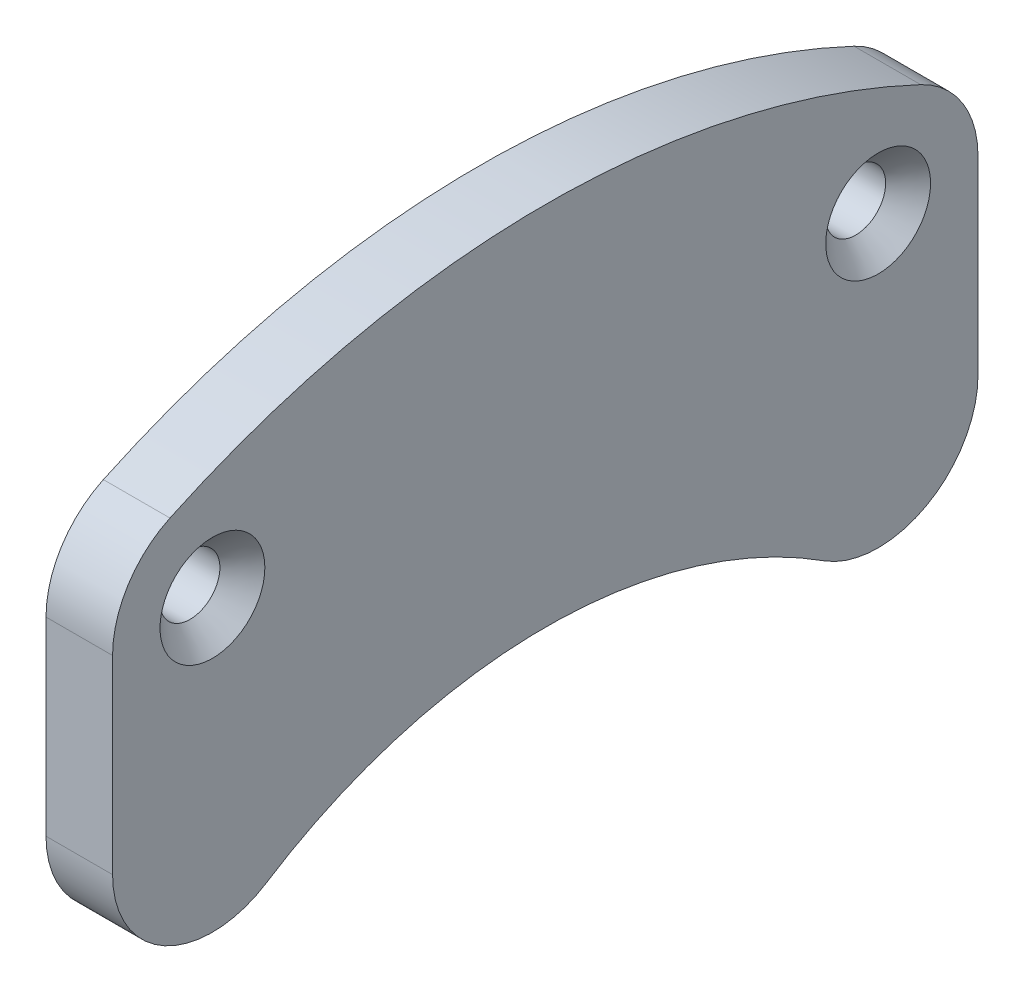
ISO-10303-21;
HEADER;
FILE_DESCRIPTION(('STEP AP214'),'2;1');
FILE_NAME('part.step','',(''),(''),'','','');
FILE_SCHEMA(('AUTOMOTIVE_DESIGN { 1 0 10303 214 1 1 1 1 }'));
ENDSEC;
DATA;
#1=APPLICATION_CONTEXT('core data for automotive mechanical design processes');
#2=APPLICATION_PROTOCOL_DEFINITION('international standard','automotive_design',2000,#1);
#3=PRODUCT_CONTEXT('',#1,'mechanical');
#4=PRODUCT('Part','Part','',(#3));
#5=PRODUCT_RELATED_PRODUCT_CATEGORY('part','',(#4));
#6=PRODUCT_DEFINITION_FORMATION('','',#4);
#7=PRODUCT_DEFINITION_CONTEXT('part definition',#1,'design');
#8=PRODUCT_DEFINITION('design','',#6,#7);
#9=PRODUCT_DEFINITION_SHAPE('','',#8);
#10=(LENGTH_UNIT() NAMED_UNIT(*) SI_UNIT(.MILLI.,.METRE.));
#11=(NAMED_UNIT(*) PLANE_ANGLE_UNIT() SI_UNIT($,.RADIAN.));
#12=(NAMED_UNIT(*) SI_UNIT($,.STERADIAN.) SOLID_ANGLE_UNIT());
#13=UNCERTAINTY_MEASURE_WITH_UNIT(LENGTH_MEASURE(1.E-05),#10,'distance_accuracy_value','');
#14=(GEOMETRIC_REPRESENTATION_CONTEXT(3) GLOBAL_UNCERTAINTY_ASSIGNED_CONTEXT((#13)) GLOBAL_UNIT_ASSIGNED_CONTEXT((#10,
#11,#12)) REPRESENTATION_CONTEXT('',''));
#15=CARTESIAN_POINT('',(0.,0.,0.));
#16=DIRECTION('',(0.,0.,1.));
#17=DIRECTION('',(1.,0.,0.));
#18=AXIS2_PLACEMENT_3D('',#15,#16,#17);
#19=CARTESIAN_POINT('',(-36.7,0.,-26.));
#20=DIRECTION('',(0.,0.,1.));
#21=DIRECTION('',(0.,-1.,0.));
#22=AXIS2_PLACEMENT_3D('',#19,#20,#21);
#23=PLANE('',#22);
#24=DIRECTION('',(0.,-1.,0.));
#25=VECTOR('',#24,1.);
#26=CARTESIAN_POINT('',(-32.7,0.,-26.));
#27=LINE('',#26,#25);
#28=CARTESIAN_POINT('',(-32.7,-4.46765936372653,-26.));
#29=VERTEX_POINT('',#28);
#30=CARTESIAN_POINT('',(-32.7,-15.8712351674532,-26.));
#31=VERTEX_POINT('',#30);
#32=EDGE_CURVE('E137',#29,#31,#27,.T.);
#33=ORIENTED_EDGE('',*,*,#32,.T.);
#34=DIRECTION('',(1.,0.,0.));
#35=VECTOR('',#34,1.);
#36=CARTESIAN_POINT('',(-36.7,-15.8712351674532,-26.));
#37=LINE('',#36,#35);
#38=CARTESIAN_POINT('',(-36.7,-15.8712351674532,-26.));
#39=VERTEX_POINT('',#38);
#40=EDGE_CURVE('E62',#31,#39,#37,.F.);
#41=ORIENTED_EDGE('',*,*,#40,.T.);
#42=DIRECTION('',(0.,-1.,0.));
#43=VECTOR('',#42,1.);
#44=CARTESIAN_POINT('',(-36.7,0.,-26.));
#45=LINE('',#44,#43);
#46=CARTESIAN_POINT('',(-36.7,-4.46765936372653,-26.));
#47=VERTEX_POINT('',#46);
#48=EDGE_CURVE('E118',#47,#39,#45,.T.);
#49=ORIENTED_EDGE('',*,*,#48,.F.);
#50=DIRECTION('',(1.,0.,0.));
#51=VECTOR('',#50,1.);
#52=CARTESIAN_POINT('',(-36.7,-4.46765936372653,-26.));
#53=LINE('',#52,#51);
#54=EDGE_CURVE('E108',#47,#29,#53,.T.);
#55=ORIENTED_EDGE('',*,*,#54,.T.);
#56=EDGE_LOOP('',(#33,#41,#49,#55));
#57=FACE_BOUND('',#56,.T.);
#58=ADVANCED_FACE('F39',(#57),#23,.F.);
#59=CARTESIAN_POINT('',(-36.7,-47.,0.));
#60=DIRECTION('',(1.,0.,0.));
#61=DIRECTION('',(0.,0.,-1.));
#62=AXIS2_PLACEMENT_3D('',#59,#60,#61);
#63=CYLINDRICAL_SURFACE('',#62,31.);
#64=CARTESIAN_POINT('',(-36.7,-47.,0.));
#65=DIRECTION('',(1.,0.,0.));
#66=DIRECTION('',(0.,0.,-1.));
#67=AXIS2_PLACEMENT_3D('',#64,#65,#66);
#68=CIRCLE('',#67,31.);
#69=CARTESIAN_POINT('',(-36.7,-20.9191429781365,-16.7567567567568));
#70=VERTEX_POINT('',#69);
#71=CARTESIAN_POINT('',(-36.7,-20.9191429781365,16.7567567567568));
#72=VERTEX_POINT('',#71);
#73=EDGE_CURVE('E116',#70,#72,#68,.T.);
#74=ORIENTED_EDGE('',*,*,#73,.F.);
#75=DIRECTION('',(1.,0.,0.));
#76=VECTOR('',#75,1.);
#77=CARTESIAN_POINT('',(-36.7,-20.9191429781365,-16.7567567567568));
#78=LINE('',#77,#76);
#79=CARTESIAN_POINT('',(-32.7,-20.9191429781365,-16.7567567567568));
#80=VERTEX_POINT('',#79);
#81=EDGE_CURVE('E159',#70,#80,#78,.T.);
#82=ORIENTED_EDGE('',*,*,#81,.T.);
#83=CARTESIAN_POINT('',(-32.7,-47.,0.));
#84=DIRECTION('',(1.,0.,0.));
#85=DIRECTION('',(0.,0.,-1.));
#86=AXIS2_PLACEMENT_3D('',#83,#84,#85);
#87=CIRCLE('',#86,31.);
#88=CARTESIAN_POINT('',(-32.7,-20.9191429781365,16.7567567567568));
#89=VERTEX_POINT('',#88);
#90=EDGE_CURVE('E120',#80,#89,#87,.T.);
#91=ORIENTED_EDGE('',*,*,#90,.T.);
#92=DIRECTION('',(1.,0.,0.));
#93=VECTOR('',#92,1.);
#94=CARTESIAN_POINT('',(-36.7,-20.9191429781365,16.7567567567568));
#95=LINE('',#94,#93);
#96=EDGE_CURVE('E154',#89,#72,#95,.F.);
#97=ORIENTED_EDGE('',*,*,#96,.T.);
#98=EDGE_LOOP('',(#74,#82,#91,#97));
#99=FACE_BOUND('',#98,.T.);
#100=ADVANCED_FACE('F171',(#99),#63,.F.);
#101=CARTESIAN_POINT('',(-36.7,0.,26.));
#102=DIRECTION('',(0.,0.,1.));
#103=DIRECTION('',(0.,-1.,0.));
#104=AXIS2_PLACEMENT_3D('',#101,#102,#103);
#105=PLANE('',#104);
#106=DIRECTION('',(0.,-1.,0.));
#107=VECTOR('',#106,1.);
#108=CARTESIAN_POINT('',(-36.7,0.,26.));
#109=LINE('',#108,#107);
#110=CARTESIAN_POINT('',(-36.7,-4.46765936372653,26.));
#111=VERTEX_POINT('',#110);
#112=CARTESIAN_POINT('',(-36.7,-15.8712351674532,26.));
#113=VERTEX_POINT('',#112);
#114=EDGE_CURVE('E134',#111,#113,#109,.T.);
#115=ORIENTED_EDGE('',*,*,#114,.T.);
#116=DIRECTION('',(-1.,0.,0.));
#117=VECTOR('',#116,1.);
#118=CARTESIAN_POINT('',(-32.7,-15.8712351674532,26.));
#119=LINE('',#118,#117);
#120=CARTESIAN_POINT('',(-32.7,-15.8712351674532,26.));
#121=VERTEX_POINT('',#120);
#122=EDGE_CURVE('E11',#113,#121,#119,.F.);
#123=ORIENTED_EDGE('',*,*,#122,.T.);
#124=DIRECTION('',(0.,-1.,0.));
#125=VECTOR('',#124,1.);
#126=CARTESIAN_POINT('',(-32.7,0.,26.));
#127=LINE('',#126,#125);
#128=CARTESIAN_POINT('',(-32.7,-4.46765936372653,26.));
#129=VERTEX_POINT('',#128);
#130=EDGE_CURVE('E147',#129,#121,#127,.T.);
#131=ORIENTED_EDGE('',*,*,#130,.F.);
#132=DIRECTION('',(1.,0.,0.));
#133=VECTOR('',#132,1.);
#134=CARTESIAN_POINT('',(-36.7,-4.46765936372653,26.));
#135=LINE('',#134,#133);
#136=EDGE_CURVE('E152',#111,#129,#135,.T.);
#137=ORIENTED_EDGE('',*,*,#136,.F.);
#138=EDGE_LOOP('',(#115,#123,#131,#137));
#139=FACE_BOUND('',#138,.T.);
#140=ADVANCED_FACE('F181',(#139),#105,.T.);
#141=CARTESIAN_POINT('',(-36.7,-4.46765936372653,20.));
#142=DIRECTION('',(1.,0.,0.));
#143=DIRECTION('',(0.,0.,-1.));
#144=AXIS2_PLACEMENT_3D('',#141,#142,#143);
#145=CYLINDRICAL_SURFACE('',#144,6.00000000000001);
#146=CARTESIAN_POINT('',(-32.7,-4.46765936372653,20.));
#147=DIRECTION('',(1.,0.,0.));
#148=DIRECTION('',(0.,0.,-1.));
#149=AXIS2_PLACEMENT_3D('',#146,#147,#148);
#150=CIRCLE('',#149,6.00000000000001);
#151=CARTESIAN_POINT('',(-32.7,0.962001143031799,22.5531914893617));
#152=VERTEX_POINT('',#151);
#153=EDGE_CURVE('E144',#152,#129,#150,.T.);
#154=ORIENTED_EDGE('',*,*,#153,.F.);
#155=DIRECTION('',(1.,0.,0.));
#156=VECTOR('',#155,1.);
#157=CARTESIAN_POINT('',(-36.7,0.962001143031799,22.5531914893617));
#158=LINE('',#157,#156);
#159=CARTESIAN_POINT('',(-36.7,0.962001143031799,22.5531914893617));
#160=VERTEX_POINT('',#159);
#161=EDGE_CURVE('E155',#160,#152,#158,.T.);
#162=ORIENTED_EDGE('',*,*,#161,.F.);
#163=CARTESIAN_POINT('',(-36.7,-4.46765936372653,20.));
#164=DIRECTION('',(1.,0.,0.));
#165=DIRECTION('',(0.,0.,-1.));
#166=AXIS2_PLACEMENT_3D('',#163,#164,#165);
#167=CIRCLE('',#166,6.00000000000001);
#168=EDGE_CURVE('E128',#160,#111,#167,.T.);
#169=ORIENTED_EDGE('',*,*,#168,.T.);
#170=ORIENTED_EDGE('',*,*,#136,.T.);
#171=EDGE_LOOP('',(#154,#162,#169,#170));
#172=FACE_BOUND('',#171,.T.);
#173=ADVANCED_FACE('F185',(#172),#145,.T.);
#174=CARTESIAN_POINT('',(-36.7,-47.,0.));
#175=DIRECTION('',(1.,0.,0.));
#176=DIRECTION('',(0.,0.,-1.));
#177=AXIS2_PLACEMENT_3D('',#174,#175,#176);
#178=CYLINDRICAL_SURFACE('',#177,53.);
#179=CARTESIAN_POINT('',(-32.7,-47.,0.));
#180=DIRECTION('',(1.,0.,0.));
#181=DIRECTION('',(0.,0.,-1.));
#182=AXIS2_PLACEMENT_3D('',#179,#180,#181);
#183=CIRCLE('',#182,53.);
#184=CARTESIAN_POINT('',(-32.7,0.962001143031799,-22.5531914893617));
#185=VERTEX_POINT('',#184);
#186=EDGE_CURVE('E141',#185,#152,#183,.T.);
#187=ORIENTED_EDGE('',*,*,#186,.F.);
#188=DIRECTION('',(1.,0.,0.));
#189=VECTOR('',#188,1.);
#190=CARTESIAN_POINT('',(-36.7,0.962001143031799,-22.5531914893617));
#191=LINE('',#190,#189);
#192=CARTESIAN_POINT('',(-36.7,0.962001143031799,-22.5531914893617));
#193=VERTEX_POINT('',#192);
#194=EDGE_CURVE('E115',#193,#185,#191,.T.);
#195=ORIENTED_EDGE('',*,*,#194,.F.);
#196=CARTESIAN_POINT('',(-36.7,-47.,0.));
#197=DIRECTION('',(1.,0.,0.));
#198=DIRECTION('',(0.,0.,-1.));
#199=AXIS2_PLACEMENT_3D('',#196,#197,#198);
#200=CIRCLE('',#199,53.);
#201=EDGE_CURVE('E126',#193,#160,#200,.T.);
#202=ORIENTED_EDGE('',*,*,#201,.T.);
#203=ORIENTED_EDGE('',*,*,#161,.T.);
#204=EDGE_LOOP('',(#187,#195,#202,#203));
#205=FACE_BOUND('',#204,.T.);
#206=ADVANCED_FACE('F187',(#205),#178,.T.);
#207=CARTESIAN_POINT('',(-36.7,-4.46765936372653,-20.));
#208=DIRECTION('',(1.,0.,0.));
#209=DIRECTION('',(0.,0.,-1.));
#210=AXIS2_PLACEMENT_3D('',#207,#208,#209);
#211=CYLINDRICAL_SURFACE('',#210,6.00000000000001);
#212=CARTESIAN_POINT('',(-32.7,-4.46765936372653,-20.));
#213=DIRECTION('',(1.,0.,0.));
#214=DIRECTION('',(0.,0.,-1.));
#215=AXIS2_PLACEMENT_3D('',#212,#213,#214);
#216=CIRCLE('',#215,6.00000000000001);
#217=EDGE_CURVE('E113',#29,#185,#216,.T.);
#218=ORIENTED_EDGE('',*,*,#217,.F.);
#219=ORIENTED_EDGE('',*,*,#54,.F.);
#220=CARTESIAN_POINT('',(-36.7,-4.46765936372653,-20.));
#221=DIRECTION('',(1.,0.,0.));
#222=DIRECTION('',(0.,0.,-1.));
#223=AXIS2_PLACEMENT_3D('',#220,#221,#222);
#224=CIRCLE('',#223,6.00000000000001);
#225=EDGE_CURVE('E111',#47,#193,#224,.T.);
#226=ORIENTED_EDGE('',*,*,#225,.T.);
#227=ORIENTED_EDGE('',*,*,#194,.T.);
#228=EDGE_LOOP('',(#218,#219,#226,#227));
#229=FACE_BOUND('',#228,.T.);
#230=ADVANCED_FACE('F109',(#229),#211,.T.);
#231=CARTESIAN_POINT('',(-36.7,0.,0.));
#232=DIRECTION('',(1.,0.,0.));
#233=DIRECTION('',(0.,0.,-1.));
#234=AXIS2_PLACEMENT_3D('',#231,#232,#233);
#235=PLANE('',#234);
#236=CARTESIAN_POINT('',(-36.7,-4.46765936372653,20.));
#237=DIRECTION('',(1.,0.,0.));
#238=DIRECTION('',(0.,0.,-1.));
#239=AXIS2_PLACEMENT_3D('',#236,#237,#238);
#240=CIRCLE('',#239,1.8);
#241=CARTESIAN_POINT('',(-36.7,-4.46765936372653,18.2));
#242=VERTEX_POINT('',#241);
#243=EDGE_CURVE('E344',#242,#242,#240,.T.);
#244=ORIENTED_EDGE('',*,*,#243,.T.);
#245=EDGE_LOOP('',(#244));
#246=FACE_BOUND('',#245,.T.);
#247=CARTESIAN_POINT('',(-36.7,-4.46765936372653,-20.));
#248=DIRECTION('',(1.,0.,0.));
#249=DIRECTION('',(0.,0.,-1.));
#250=AXIS2_PLACEMENT_3D('',#247,#248,#249);
#251=CIRCLE('',#250,1.8);
#252=CARTESIAN_POINT('',(-36.7,-4.46765936372653,-21.8));
#253=VERTEX_POINT('',#252);
#254=EDGE_CURVE('E139',#253,#253,#251,.T.);
#255=ORIENTED_EDGE('',*,*,#254,.T.);
#256=EDGE_LOOP('',(#255));
#257=FACE_BOUND('',#256,.T.);
#258=ORIENTED_EDGE('',*,*,#48,.T.);
#259=CARTESIAN_POINT('',(-36.7,-15.8712351674532,-20.));
#260=DIRECTION('',(1.,0.,0.));
#261=DIRECTION('',(0.,0.,-1.));
#262=AXIS2_PLACEMENT_3D('',#259,#260,#261);
#263=CIRCLE('',#262,6.);
#264=EDGE_CURVE('E47',#39,#70,#263,.F.);
#265=ORIENTED_EDGE('',*,*,#264,.T.);
#266=ORIENTED_EDGE('',*,*,#73,.T.);
#267=CARTESIAN_POINT('',(-36.7,-15.8712351674532,20.));
#268=DIRECTION('',(1.,0.,0.));
#269=DIRECTION('',(0.,0.,-1.));
#270=AXIS2_PLACEMENT_3D('',#267,#268,#269);
#271=CIRCLE('',#270,6.);
#272=EDGE_CURVE('E54',#72,#113,#271,.F.);
#273=ORIENTED_EDGE('',*,*,#272,.T.);
#274=ORIENTED_EDGE('',*,*,#114,.F.);
#275=ORIENTED_EDGE('',*,*,#168,.F.);
#276=ORIENTED_EDGE('',*,*,#201,.F.);
#277=ORIENTED_EDGE('',*,*,#225,.F.);
#278=EDGE_LOOP('',(#258,#265,#266,#273,#274,#275,#276,#277));
#279=FACE_BOUND('',#278,.T.);
#280=ADVANCED_FACE('F123',(#246,#257,#279),#235,.F.);
#281=CARTESIAN_POINT('',(-32.7,0.,0.));
#282=DIRECTION('',(1.,0.,0.));
#283=DIRECTION('',(0.,0.,-1.));
#284=AXIS2_PLACEMENT_3D('',#281,#282,#283);
#285=PLANE('',#284);
#286=CARTESIAN_POINT('',(-32.7,-4.46765936372653,20.));
#287=DIRECTION('',(1.,0.,0.));
#288=DIRECTION('',(0.,0.,-1.));
#289=AXIS2_PLACEMENT_3D('',#286,#287,#288);
#290=CIRCLE('',#289,3.15);
#291=CARTESIAN_POINT('',(-32.7,-4.46765936372653,16.85));
#292=VERTEX_POINT('',#291);
#293=EDGE_CURVE('E342',#292,#292,#290,.T.);
#294=ORIENTED_EDGE('',*,*,#293,.F.);
#295=EDGE_LOOP('',(#294));
#296=FACE_BOUND('',#295,.T.);
#297=CARTESIAN_POINT('',(-32.7,-4.46765936372653,-20.));
#298=DIRECTION('',(1.,0.,0.));
#299=DIRECTION('',(0.,0.,-1.));
#300=AXIS2_PLACEMENT_3D('',#297,#298,#299);
#301=CIRCLE('',#300,3.15);
#302=CARTESIAN_POINT('',(-32.7,-4.46765936372653,-23.15));
#303=VERTEX_POINT('',#302);
#304=EDGE_CURVE('E349',#303,#303,#301,.T.);
#305=ORIENTED_EDGE('',*,*,#304,.F.);
#306=EDGE_LOOP('',(#305));
#307=FACE_BOUND('',#306,.T.);
#308=ORIENTED_EDGE('',*,*,#90,.F.);
#309=CARTESIAN_POINT('',(-32.7,-15.8712351674532,-20.));
#310=DIRECTION('',(1.,0.,0.));
#311=DIRECTION('',(0.,0.,-1.));
#312=AXIS2_PLACEMENT_3D('',#309,#310,#311);
#313=CIRCLE('',#312,6.);
#314=EDGE_CURVE('E164',#80,#31,#313,.T.);
#315=ORIENTED_EDGE('',*,*,#314,.T.);
#316=ORIENTED_EDGE('',*,*,#32,.F.);
#317=ORIENTED_EDGE('',*,*,#217,.T.);
#318=ORIENTED_EDGE('',*,*,#186,.T.);
#319=ORIENTED_EDGE('',*,*,#153,.T.);
#320=ORIENTED_EDGE('',*,*,#130,.T.);
#321=CARTESIAN_POINT('',(-32.7,-15.8712351674532,20.));
#322=DIRECTION('',(1.,0.,0.));
#323=DIRECTION('',(0.,0.,-1.));
#324=AXIS2_PLACEMENT_3D('',#321,#322,#323);
#325=CIRCLE('',#324,6.);
#326=EDGE_CURVE('E162',#121,#89,#325,.T.);
#327=ORIENTED_EDGE('',*,*,#326,.T.);
#328=EDGE_LOOP('',(#308,#315,#316,#317,#318,#319,#320,#327));
#329=FACE_BOUND('',#328,.T.);
#330=ADVANCED_FACE('F176',(#296,#307,#329),#285,.T.);
#331=CARTESIAN_POINT('',(-36.7,-15.8712351674532,-20.));
#332=DIRECTION('',(1.,0.,0.));
#333=DIRECTION('',(0.,0.,-1.));
#334=AXIS2_PLACEMENT_3D('',#331,#332,#333);
#335=CYLINDRICAL_SURFACE('',#334,6.);
#336=ORIENTED_EDGE('',*,*,#264,.F.);
#337=ORIENTED_EDGE('',*,*,#40,.F.);
#338=ORIENTED_EDGE('',*,*,#314,.F.);
#339=ORIENTED_EDGE('',*,*,#81,.F.);
#340=EDGE_LOOP('',(#336,#337,#338,#339));
#341=FACE_BOUND('',#340,.T.);
#342=ADVANCED_FACE('F174',(#341),#335,.T.);
#343=CARTESIAN_POINT('',(-36.7,-15.8712351674532,20.));
#344=DIRECTION('',(1.,0.,0.));
#345=DIRECTION('',(0.,0.,-1.));
#346=AXIS2_PLACEMENT_3D('',#343,#344,#345);
#347=CYLINDRICAL_SURFACE('',#346,6.);
#348=ORIENTED_EDGE('',*,*,#272,.F.);
#349=ORIENTED_EDGE('',*,*,#96,.F.);
#350=ORIENTED_EDGE('',*,*,#326,.F.);
#351=ORIENTED_EDGE('',*,*,#122,.F.);
#352=EDGE_LOOP('',(#348,#349,#350,#351));
#353=FACE_BOUND('',#352,.T.);
#354=ADVANCED_FACE('F41',(#353),#347,.T.);
#355=CARTESIAN_POINT('',(-32.7,-4.46765936372653,-20.));
#356=DIRECTION('',(1.,0.,0.));
#357=DIRECTION('',(0.,0.,-1.));
#358=AXIS2_PLACEMENT_3D('',#355,#356,#357);
#359=CYLINDRICAL_SURFACE('',#358,1.8);
#360=ORIENTED_EDGE('',*,*,#254,.F.);
#361=EDGE_LOOP('',(#360));
#362=FACE_BOUND('',#361,.T.);
#363=CARTESIAN_POINT('',(-34.05,-4.46765936372653,-20.));
#364=DIRECTION('',(1.,0.,0.));
#365=DIRECTION('',(0.,0.,-1.));
#366=AXIS2_PLACEMENT_3D('',#363,#364,#365);
#367=CIRCLE('',#366,1.8);
#368=CARTESIAN_POINT('',(-34.05,-4.46765936372653,-21.8));
#369=VERTEX_POINT('',#368);
#370=EDGE_CURVE('E352',#369,#369,#367,.T.);
#371=ORIENTED_EDGE('',*,*,#370,.T.);
#372=EDGE_LOOP('',(#371));
#373=FACE_BOUND('',#372,.T.);
#374=ADVANCED_FACE('F207',(#362,#373),#359,.F.);
#375=CARTESIAN_POINT('',(-32.7,-4.46765936372653,-20.));
#376=DIRECTION('',(1.,0.,0.));
#377=DIRECTION('',(0.,0.,-1.));
#378=AXIS2_PLACEMENT_3D('',#375,#376,#377);
#379=CONICAL_SURFACE('',#378,3.15,0.785398163397447);
#380=ORIENTED_EDGE('',*,*,#370,.F.);
#381=EDGE_LOOP('',(#380));
#382=FACE_BOUND('',#381,.T.);
#383=ORIENTED_EDGE('',*,*,#304,.T.);
#384=EDGE_LOOP('',(#383));
#385=FACE_BOUND('',#384,.T.);
#386=ADVANCED_FACE('F290',(#382,#385),#379,.F.);
#387=CARTESIAN_POINT('',(-32.7,-4.46765936372653,20.));
#388=DIRECTION('',(1.,0.,0.));
#389=DIRECTION('',(0.,0.,-1.));
#390=AXIS2_PLACEMENT_3D('',#387,#388,#389);
#391=CYLINDRICAL_SURFACE('',#390,1.8);
#392=ORIENTED_EDGE('',*,*,#243,.F.);
#393=EDGE_LOOP('',(#392));
#394=FACE_BOUND('',#393,.T.);
#395=CARTESIAN_POINT('',(-34.05,-4.46765936372653,20.));
#396=DIRECTION('',(1.,0.,0.));
#397=DIRECTION('',(0.,0.,-1.));
#398=AXIS2_PLACEMENT_3D('',#395,#396,#397);
#399=CIRCLE('',#398,1.8);
#400=CARTESIAN_POINT('',(-34.05,-4.46765936372653,18.2));
#401=VERTEX_POINT('',#400);
#402=EDGE_CURVE('E340',#401,#401,#399,.T.);
#403=ORIENTED_EDGE('',*,*,#402,.T.);
#404=EDGE_LOOP('',(#403));
#405=FACE_BOUND('',#404,.T.);
#406=ADVANCED_FACE('F299',(#394,#405),#391,.F.);
#407=CARTESIAN_POINT('',(-32.7,-4.46765936372653,20.));
#408=DIRECTION('',(1.,0.,0.));
#409=DIRECTION('',(0.,0.,-1.));
#410=AXIS2_PLACEMENT_3D('',#407,#408,#409);
#411=CONICAL_SURFACE('',#410,3.15,0.785398163397447);
#412=ORIENTED_EDGE('',*,*,#402,.F.);
#413=EDGE_LOOP('',(#412));
#414=FACE_BOUND('',#413,.T.);
#415=ORIENTED_EDGE('',*,*,#293,.T.);
#416=EDGE_LOOP('',(#415));
#417=FACE_BOUND('',#416,.T.);
#418=ADVANCED_FACE('F309',(#414,#417),#411,.F.);
#419=CLOSED_SHELL('',(#58,#100,#140,#173,#206,#230,#280,#330,#342,#354,#374,#386,#406,#418));
#420=MANIFOLD_SOLID_BREP('B2',#419);
#421=ADVANCED_BREP_SHAPE_REPRESENTATION('',(#18,#420),#14);
#422=SHAPE_DEFINITION_REPRESENTATION(#9,#421);
ENDSEC;
END-ISO-10303-21;
